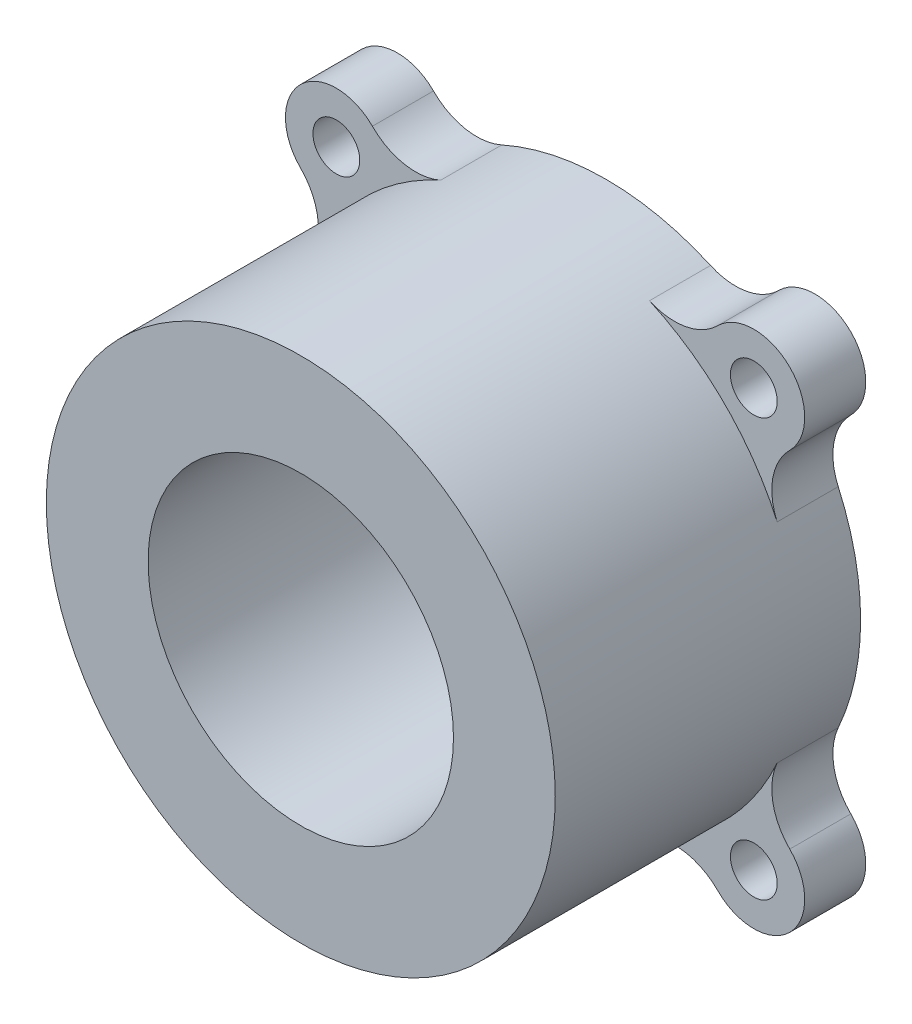
ISO-10303-21;
HEADER;
FILE_DESCRIPTION(('STEP AP214'),'2;1');
FILE_NAME('part.step','',(''),(''),'','','');
FILE_SCHEMA(('AUTOMOTIVE_DESIGN { 1 0 10303 214 1 1 1 1 }'));
ENDSEC;
DATA;
#1=APPLICATION_CONTEXT('core data for automotive mechanical design processes');
#2=APPLICATION_PROTOCOL_DEFINITION('international standard','automotive_design',2000,#1);
#3=PRODUCT_CONTEXT('',#1,'mechanical');
#4=PRODUCT('Part','Part','',(#3));
#5=PRODUCT_RELATED_PRODUCT_CATEGORY('part','',(#4));
#6=PRODUCT_DEFINITION_FORMATION('','',#4);
#7=PRODUCT_DEFINITION_CONTEXT('part definition',#1,'design');
#8=PRODUCT_DEFINITION('design','',#6,#7);
#9=PRODUCT_DEFINITION_SHAPE('','',#8);
#10=(LENGTH_UNIT() NAMED_UNIT(*) SI_UNIT(.MILLI.,.METRE.));
#11=(NAMED_UNIT(*) PLANE_ANGLE_UNIT() SI_UNIT($,.RADIAN.));
#12=(NAMED_UNIT(*) SI_UNIT($,.STERADIAN.) SOLID_ANGLE_UNIT());
#13=UNCERTAINTY_MEASURE_WITH_UNIT(LENGTH_MEASURE(1.E-05),#10,'distance_accuracy_value','');
#14=(GEOMETRIC_REPRESENTATION_CONTEXT(3) GLOBAL_UNCERTAINTY_ASSIGNED_CONTEXT((#13)) GLOBAL_UNIT_ASSIGNED_CONTEXT((#10,
#11,#12)) REPRESENTATION_CONTEXT('',''));
#15=CARTESIAN_POINT('',(0.,0.,0.));
#16=DIRECTION('',(0.,0.,1.));
#17=DIRECTION('',(1.,0.,0.));
#18=AXIS2_PLACEMENT_3D('',#15,#16,#17);
#19=CARTESIAN_POINT('',(0.,0.,30.));
#20=DIRECTION('',(0.,0.,1.));
#21=DIRECTION('',(1.,0.,0.));
#22=AXIS2_PLACEMENT_3D('',#19,#20,#21);
#23=PLANE('',#22);
#24=CARTESIAN_POINT('',(0.,0.,30.));
#25=DIRECTION('',(0.,0.,1.));
#26=DIRECTION('',(1.,0.,0.));
#27=AXIS2_PLACEMENT_3D('',#24,#25,#26);
#28=CIRCLE('',#27,25.);
#29=CARTESIAN_POINT('',(25.,0.,30.));
#30=VERTEX_POINT('',#29);
#31=EDGE_CURVE('E185',#30,#30,#28,.T.);
#32=ORIENTED_EDGE('',*,*,#31,.T.);
#33=EDGE_LOOP('',(#32));
#34=FACE_BOUND('',#33,.T.);
#35=CARTESIAN_POINT('',(0.,0.,30.));
#36=DIRECTION('',(0.,0.,1.));
#37=DIRECTION('',(1.,0.,0.));
#38=AXIS2_PLACEMENT_3D('',#35,#36,#37);
#39=CIRCLE('',#38,15.);
#40=CARTESIAN_POINT('',(15.,0.,30.));
#41=VERTEX_POINT('',#40);
#42=EDGE_CURVE('E182',#41,#41,#39,.T.);
#43=ORIENTED_EDGE('',*,*,#42,.F.);
#44=EDGE_LOOP('',(#43));
#45=FACE_BOUND('',#44,.T.);
#46=ADVANCED_FACE('F33',(#34,#45),#23,.T.);
#47=CARTESIAN_POINT('',(0.,0.,0.));
#48=DIRECTION('',(0.,0.,1.));
#49=DIRECTION('',(1.,0.,0.));
#50=AXIS2_PLACEMENT_3D('',#47,#48,#49);
#51=PLANE('',#50);
#52=CARTESIAN_POINT('',(0.,0.,0.));
#53=DIRECTION('',(0.,0.,1.));
#54=DIRECTION('',(1.,0.,0.));
#55=AXIS2_PLACEMENT_3D('',#52,#53,#54);
#56=CIRCLE('',#55,25.);
#57=CARTESIAN_POINT('',(10.2546291287098,22.8000566102941,0.));
#58=VERTEX_POINT('',#57);
#59=CARTESIAN_POINT('',(-10.2546291287101,22.800056610294,0.));
#60=VERTEX_POINT('',#59);
#61=EDGE_CURVE('E178',#58,#60,#56,.T.);
#62=ORIENTED_EDGE('',*,*,#61,.F.);
#63=CARTESIAN_POINT('',(12.7157401196002,28.2720701967647,0.));
#64=DIRECTION('',(0.,0.,1.));
#65=DIRECTION('',(1.,0.,0.));
#66=AXIS2_PLACEMENT_3D('',#63,#64,#65);
#67=CIRCLE('',#66,6.);
#68=CARTESIAN_POINT('',(16.9650255022235,24.0360846282076,0.));
#69=VERTEX_POINT('',#68);
#70=EDGE_CURVE('E247',#58,#69,#67,.T.);
#71=ORIENTED_EDGE('',*,*,#70,.T.);
#72=CARTESIAN_POINT('',(20.5060966544097,20.5060966544101,0.));
#73=DIRECTION('',(0.,0.,-1.));
#74=DIRECTION('',(-1.,0.,0.));
#75=AXIS2_PLACEMENT_3D('',#72,#73,#74);
#76=CIRCLE('',#75,5.);
#77=CARTESIAN_POINT('',(24.0360846282073,16.9650255022241,0.));
#78=VERTEX_POINT('',#77);
#79=EDGE_CURVE('E356',#69,#78,#76,.T.);
#80=ORIENTED_EDGE('',*,*,#79,.T.);
#81=CARTESIAN_POINT('',(28.2720701967644,12.7157401196008,0.));
#82=DIRECTION('',(0.,0.,1.));
#83=DIRECTION('',(1.,0.,0.));
#84=AXIS2_PLACEMENT_3D('',#81,#82,#83);
#85=CIRCLE('',#84,6.);
#86=CARTESIAN_POINT('',(22.8000566102939,10.2546291287103,0.));
#87=VERTEX_POINT('',#86);
#88=EDGE_CURVE('E11',#78,#87,#85,.T.);
#89=ORIENTED_EDGE('',*,*,#88,.T.);
#90=CARTESIAN_POINT('',(22.8000566102941,-10.2546291287099,0.));
#91=VERTEX_POINT('',#90);
#92=EDGE_CURVE('E164',#91,#87,#56,.T.);
#93=ORIENTED_EDGE('',*,*,#92,.F.);
#94=CARTESIAN_POINT('',(28.2720701967646,-12.7157401196003,0.));
#95=DIRECTION('',(0.,0.,1.));
#96=DIRECTION('',(1.,0.,0.));
#97=AXIS2_PLACEMENT_3D('',#94,#95,#96);
#98=CIRCLE('',#97,6.);
#99=CARTESIAN_POINT('',(24.0360846282076,-16.9650255022236,0.));
#100=VERTEX_POINT('',#99);
#101=EDGE_CURVE('E145',#91,#100,#98,.T.);
#102=ORIENTED_EDGE('',*,*,#101,.T.);
#103=CARTESIAN_POINT('',(20.50609665441,-20.5060966544097,0.));
#104=DIRECTION('',(0.,0.,-1.));
#105=DIRECTION('',(-1.,0.,0.));
#106=AXIS2_PLACEMENT_3D('',#103,#104,#105);
#107=CIRCLE('',#106,5.);
#108=CARTESIAN_POINT('',(16.965025502224,-24.0360846282073,0.));
#109=VERTEX_POINT('',#108);
#110=EDGE_CURVE('E260',#100,#109,#107,.T.);
#111=ORIENTED_EDGE('',*,*,#110,.T.);
#112=CARTESIAN_POINT('',(12.7157401196007,-28.2720701967645,0.));
#113=DIRECTION('',(0.,0.,1.));
#114=DIRECTION('',(1.,0.,0.));
#115=AXIS2_PLACEMENT_3D('',#112,#113,#114);
#116=CIRCLE('',#115,6.);
#117=CARTESIAN_POINT('',(10.2546291287103,-22.8000566102939,0.));
#118=VERTEX_POINT('',#117);
#119=EDGE_CURVE('E227',#109,#118,#116,.T.);
#120=ORIENTED_EDGE('',*,*,#119,.T.);
#121=CARTESIAN_POINT('',(-10.25462912871,-22.800056610294,0.));
#122=VERTEX_POINT('',#121);
#123=EDGE_CURVE('E177',#122,#118,#56,.T.);
#124=ORIENTED_EDGE('',*,*,#123,.F.);
#125=CARTESIAN_POINT('',(-12.7157401196004,-28.2720701967646,0.));
#126=DIRECTION('',(0.,0.,1.));
#127=DIRECTION('',(1.,0.,0.));
#128=AXIS2_PLACEMENT_3D('',#125,#126,#127);
#129=CIRCLE('',#128,6.);
#130=CARTESIAN_POINT('',(-16.9650255022237,-24.0360846282075,0.));
#131=VERTEX_POINT('',#130);
#132=EDGE_CURVE('E229',#122,#131,#129,.T.);
#133=ORIENTED_EDGE('',*,*,#132,.T.);
#134=CARTESIAN_POINT('',(-20.5060966544098,-20.50609665441,0.));
#135=DIRECTION('',(0.,0.,-1.));
#136=DIRECTION('',(-1.,0.,0.));
#137=AXIS2_PLACEMENT_3D('',#134,#135,#136);
#138=CIRCLE('',#137,5.);
#139=CARTESIAN_POINT('',(-24.0360846282074,-16.9650255022239,0.));
#140=VERTEX_POINT('',#139);
#141=EDGE_CURVE('E272',#131,#140,#138,.T.);
#142=ORIENTED_EDGE('',*,*,#141,.T.);
#143=CARTESIAN_POINT('',(-28.2720701967645,-12.7157401196006,0.));
#144=DIRECTION('',(0.,0.,1.));
#145=DIRECTION('',(1.,0.,0.));
#146=AXIS2_PLACEMENT_3D('',#143,#144,#145);
#147=CIRCLE('',#146,6.);
#148=CARTESIAN_POINT('',(-22.800056610294,-10.2546291287102,0.));
#149=VERTEX_POINT('',#148);
#150=EDGE_CURVE('E245',#140,#149,#147,.T.);
#151=ORIENTED_EDGE('',*,*,#150,.T.);
#152=CARTESIAN_POINT('',(-22.800056610294,10.2546291287101,0.));
#153=VERTEX_POINT('',#152);
#154=EDGE_CURVE('E180',#153,#149,#56,.T.);
#155=ORIENTED_EDGE('',*,*,#154,.F.);
#156=CARTESIAN_POINT('',(-28.2720701967646,12.7157401196005,0.));
#157=DIRECTION('',(0.,0.,1.));
#158=DIRECTION('',(1.,0.,0.));
#159=AXIS2_PLACEMENT_3D('',#156,#157,#158);
#160=CIRCLE('',#159,6.);
#161=CARTESIAN_POINT('',(-24.0360846282075,16.9650255022238,0.));
#162=VERTEX_POINT('',#161);
#163=EDGE_CURVE('E234',#153,#162,#160,.T.);
#164=ORIENTED_EDGE('',*,*,#163,.T.);
#165=CARTESIAN_POINT('',(-20.5060966544099,20.5060966544099,0.));
#166=DIRECTION('',(0.,0.,-1.));
#167=DIRECTION('',(-1.,0.,0.));
#168=AXIS2_PLACEMENT_3D('',#165,#166,#167);
#169=CIRCLE('',#168,5.);
#170=CARTESIAN_POINT('',(-16.9650255022238,24.0360846282075,0.));
#171=VERTEX_POINT('',#170);
#172=EDGE_CURVE('E283',#162,#171,#169,.T.);
#173=ORIENTED_EDGE('',*,*,#172,.T.);
#174=CARTESIAN_POINT('',(-12.7157401196005,28.2720701967645,0.));
#175=DIRECTION('',(0.,0.,1.));
#176=DIRECTION('',(1.,0.,0.));
#177=AXIS2_PLACEMENT_3D('',#174,#175,#176);
#178=CIRCLE('',#177,6.);
#179=EDGE_CURVE('E241',#171,#60,#178,.T.);
#180=ORIENTED_EDGE('',*,*,#179,.T.);
#181=EDGE_LOOP('',(#62,#71,#80,#89,#93,#102,#111,#120,#124,#133,#142,#151,#155,#164,#173,#180));
#182=FACE_BOUND('',#181,.T.);
#183=CARTESIAN_POINT('',(0.,0.,0.));
#184=DIRECTION('',(0.,0.,1.));
#185=DIRECTION('',(1.,0.,0.));
#186=AXIS2_PLACEMENT_3D('',#183,#184,#185);
#187=CIRCLE('',#186,15.);
#188=CARTESIAN_POINT('',(15.,0.,0.));
#189=VERTEX_POINT('',#188);
#190=EDGE_CURVE('E289',#189,#189,#187,.T.);
#191=ORIENTED_EDGE('',*,*,#190,.T.);
#192=EDGE_LOOP('',(#191));
#193=FACE_BOUND('',#192,.T.);
#194=CARTESIAN_POINT('',(-20.5060966544099,20.5060966544099,0.));
#195=DIRECTION('',(0.,0.,-1.));
#196=DIRECTION('',(-1.,0.,0.));
#197=AXIS2_PLACEMENT_3D('',#194,#195,#196);
#198=CIRCLE('',#197,2.3);
#199=CARTESIAN_POINT('',(-22.8060966544099,20.5060966544099,0.));
#200=VERTEX_POINT('',#199);
#201=EDGE_CURVE('E277',#200,#200,#198,.T.);
#202=ORIENTED_EDGE('',*,*,#201,.F.);
#203=EDGE_LOOP('',(#202));
#204=FACE_BOUND('',#203,.T.);
#205=CARTESIAN_POINT('',(-20.5060966544098,-20.50609665441,0.));
#206=DIRECTION('',(0.,0.,-1.));
#207=DIRECTION('',(-1.,0.,0.));
#208=AXIS2_PLACEMENT_3D('',#205,#206,#207);
#209=CIRCLE('',#208,2.3);
#210=CARTESIAN_POINT('',(-22.8060966544098,-20.50609665441,0.));
#211=VERTEX_POINT('',#210);
#212=EDGE_CURVE('E259',#211,#211,#209,.T.);
#213=ORIENTED_EDGE('',*,*,#212,.F.);
#214=EDGE_LOOP('',(#213));
#215=FACE_BOUND('',#214,.T.);
#216=CARTESIAN_POINT('',(20.50609665441,-20.5060966544097,0.));
#217=DIRECTION('',(0.,0.,-1.));
#218=DIRECTION('',(-1.,0.,0.));
#219=AXIS2_PLACEMENT_3D('',#216,#217,#218);
#220=CIRCLE('',#219,2.3);
#221=CARTESIAN_POINT('',(18.20609665441,-20.5060966544097,0.));
#222=VERTEX_POINT('',#221);
#223=EDGE_CURVE('E268',#222,#222,#220,.T.);
#224=ORIENTED_EDGE('',*,*,#223,.F.);
#225=EDGE_LOOP('',(#224));
#226=FACE_BOUND('',#225,.T.);
#227=CARTESIAN_POINT('',(20.5060966544097,20.5060966544101,0.));
#228=DIRECTION('',(0.,0.,-1.));
#229=DIRECTION('',(-1.,0.,0.));
#230=AXIS2_PLACEMENT_3D('',#227,#228,#229);
#231=CIRCLE('',#230,2.3);
#232=CARTESIAN_POINT('',(18.2060966544097,20.5060966544101,0.));
#233=VERTEX_POINT('',#232);
#234=EDGE_CURVE('E362',#233,#233,#231,.T.);
#235=ORIENTED_EDGE('',*,*,#234,.F.);
#236=EDGE_LOOP('',(#235));
#237=FACE_BOUND('',#236,.T.);
#238=ADVANCED_FACE('F173',(#182,#193,#204,#215,#226,#237),#51,.F.);
#239=CARTESIAN_POINT('',(0.,0.,30.));
#240=DIRECTION('',(0.,0.,-1.));
#241=DIRECTION('',(-1.,0.,0.));
#242=AXIS2_PLACEMENT_3D('',#239,#240,#241);
#243=CYLINDRICAL_SURFACE('',#242,25.);
#244=ORIENTED_EDGE('',*,*,#123,.T.);
#245=DIRECTION('',(0.,0.,-1.));
#246=VECTOR('',#245,1.);
#247=CARTESIAN_POINT('',(10.2546291287103,-22.8000566102939,30.));
#248=LINE('',#247,#246);
#249=CARTESIAN_POINT('',(10.2546291287103,-22.8000566102939,6.));
#250=VERTEX_POINT('',#249);
#251=EDGE_CURVE('E209',#118,#250,#248,.F.);
#252=ORIENTED_EDGE('',*,*,#251,.T.);
#253=CARTESIAN_POINT('',(0.,0.,6.));
#254=DIRECTION('',(0.,0.,-1.));
#255=DIRECTION('',(-1.,0.,0.));
#256=AXIS2_PLACEMENT_3D('',#253,#254,#255);
#257=CIRCLE('',#256,25.);
#258=CARTESIAN_POINT('',(22.8000566102941,-10.2546291287099,6.));
#259=VERTEX_POINT('',#258);
#260=EDGE_CURVE('E167',#259,#250,#257,.T.);
#261=ORIENTED_EDGE('',*,*,#260,.F.);
#262=DIRECTION('',(0.,0.,-1.));
#263=VECTOR('',#262,1.);
#264=CARTESIAN_POINT('',(22.8000566102941,-10.2546291287099,30.));
#265=LINE('',#264,#263);
#266=EDGE_CURVE('E149',#259,#91,#265,.T.);
#267=ORIENTED_EDGE('',*,*,#266,.T.);
#268=ORIENTED_EDGE('',*,*,#92,.T.);
#269=DIRECTION('',(0.,0.,-1.));
#270=VECTOR('',#269,1.);
#271=CARTESIAN_POINT('',(22.8000566102939,10.2546291287103,30.));
#272=LINE('',#271,#270);
#273=CARTESIAN_POINT('',(22.8000566102939,10.2546291287103,6.));
#274=VERTEX_POINT('',#273);
#275=EDGE_CURVE('E170',#87,#274,#272,.F.);
#276=ORIENTED_EDGE('',*,*,#275,.T.);
#277=CARTESIAN_POINT('',(0.,0.,6.));
#278=DIRECTION('',(0.,0.,-1.));
#279=DIRECTION('',(-1.,0.,0.));
#280=AXIS2_PLACEMENT_3D('',#277,#278,#279);
#281=CIRCLE('',#280,25.);
#282=CARTESIAN_POINT('',(10.2546291287098,22.8000566102941,6.));
#283=VERTEX_POINT('',#282);
#284=EDGE_CURVE('E192',#283,#274,#281,.T.);
#285=ORIENTED_EDGE('',*,*,#284,.F.);
#286=DIRECTION('',(0.,0.,-1.));
#287=VECTOR('',#286,1.);
#288=CARTESIAN_POINT('',(10.2546291287098,22.8000566102941,30.));
#289=LINE('',#288,#287);
#290=EDGE_CURVE('E169',#283,#58,#289,.T.);
#291=ORIENTED_EDGE('',*,*,#290,.T.);
#292=ORIENTED_EDGE('',*,*,#61,.T.);
#293=DIRECTION('',(0.,0.,-1.));
#294=VECTOR('',#293,1.);
#295=CARTESIAN_POINT('',(-10.2546291287101,22.800056610294,30.));
#296=LINE('',#295,#294);
#297=CARTESIAN_POINT('',(-10.2546291287101,22.800056610294,6.));
#298=VERTEX_POINT('',#297);
#299=EDGE_CURVE('E200',#60,#298,#296,.F.);
#300=ORIENTED_EDGE('',*,*,#299,.T.);
#301=CARTESIAN_POINT('',(0.,0.,6.));
#302=DIRECTION('',(0.,0.,-1.));
#303=DIRECTION('',(-1.,0.,0.));
#304=AXIS2_PLACEMENT_3D('',#301,#302,#303);
#305=CIRCLE('',#304,25.);
#306=CARTESIAN_POINT('',(-22.800056610294,10.2546291287101,6.));
#307=VERTEX_POINT('',#306);
#308=EDGE_CURVE('E187',#307,#298,#305,.T.);
#309=ORIENTED_EDGE('',*,*,#308,.F.);
#310=DIRECTION('',(0.,0.,-1.));
#311=VECTOR('',#310,1.);
#312=CARTESIAN_POINT('',(-22.800056610294,10.2546291287101,30.));
#313=LINE('',#312,#311);
#314=EDGE_CURVE('E203',#307,#153,#313,.T.);
#315=ORIENTED_EDGE('',*,*,#314,.T.);
#316=ORIENTED_EDGE('',*,*,#154,.T.);
#317=DIRECTION('',(0.,0.,-1.));
#318=VECTOR('',#317,1.);
#319=CARTESIAN_POINT('',(-22.800056610294,-10.2546291287102,30.));
#320=LINE('',#319,#318);
#321=CARTESIAN_POINT('',(-22.800056610294,-10.2546291287102,6.));
#322=VERTEX_POINT('',#321);
#323=EDGE_CURVE('E197',#149,#322,#320,.F.);
#324=ORIENTED_EDGE('',*,*,#323,.T.);
#325=CARTESIAN_POINT('',(0.,0.,6.));
#326=DIRECTION('',(0.,0.,-1.));
#327=DIRECTION('',(-1.,0.,0.));
#328=AXIS2_PLACEMENT_3D('',#325,#326,#327);
#329=CIRCLE('',#328,25.);
#330=CARTESIAN_POINT('',(-10.25462912871,-22.800056610294,6.));
#331=VERTEX_POINT('',#330);
#332=EDGE_CURVE('E189',#331,#322,#329,.T.);
#333=ORIENTED_EDGE('',*,*,#332,.F.);
#334=DIRECTION('',(0.,0.,-1.));
#335=VECTOR('',#334,1.);
#336=CARTESIAN_POINT('',(-10.25462912871,-22.800056610294,30.));
#337=LINE('',#336,#335);
#338=EDGE_CURVE('E206',#331,#122,#337,.T.);
#339=ORIENTED_EDGE('',*,*,#338,.T.);
#340=EDGE_LOOP('',(#244,#252,#261,#267,#268,#276,#285,#291,#292,#300,#309,#315,#316,#324,#333,#339));
#341=FACE_BOUND('',#340,.T.);
#342=ORIENTED_EDGE('',*,*,#31,.F.);
#343=EDGE_LOOP('',(#342));
#344=FACE_BOUND('',#343,.T.);
#345=ADVANCED_FACE('F161',(#341,#344),#243,.T.);
#346=CARTESIAN_POINT('',(0.,0.,30.));
#347=DIRECTION('',(0.,0.,-1.));
#348=DIRECTION('',(-1.,0.,0.));
#349=AXIS2_PLACEMENT_3D('',#346,#347,#348);
#350=CYLINDRICAL_SURFACE('',#349,15.);
#351=ORIENTED_EDGE('',*,*,#42,.T.);
#352=EDGE_LOOP('',(#351));
#353=FACE_BOUND('',#352,.T.);
#354=ORIENTED_EDGE('',*,*,#190,.F.);
#355=EDGE_LOOP('',(#354));
#356=FACE_BOUND('',#355,.T.);
#357=ADVANCED_FACE('F297',(#353,#356),#350,.F.);
#358=CARTESIAN_POINT('',(-20.5060966544099,20.5060966544099,6.));
#359=DIRECTION('',(0.,0.,-1.));
#360=DIRECTION('',(-1.,0.,0.));
#361=AXIS2_PLACEMENT_3D('',#358,#359,#360);
#362=CYLINDRICAL_SURFACE('',#361,5.);
#363=ORIENTED_EDGE('',*,*,#172,.F.);
#364=DIRECTION('',(0.,0.,-1.));
#365=VECTOR('',#364,1.);
#366=CARTESIAN_POINT('',(-24.0360846282075,16.9650255022238,6.));
#367=LINE('',#366,#365);
#368=CARTESIAN_POINT('',(-24.0360846282075,16.9650255022238,6.));
#369=VERTEX_POINT('',#368);
#370=EDGE_CURVE('E220',#162,#369,#367,.F.);
#371=ORIENTED_EDGE('',*,*,#370,.T.);
#372=CARTESIAN_POINT('',(-20.5060966544099,20.5060966544099,6.));
#373=DIRECTION('',(0.,0.,-1.));
#374=DIRECTION('',(-1.,0.,0.));
#375=AXIS2_PLACEMENT_3D('',#372,#373,#374);
#376=CIRCLE('',#375,5.);
#377=CARTESIAN_POINT('',(-16.9650255022238,24.0360846282075,6.));
#378=VERTEX_POINT('',#377);
#379=EDGE_CURVE('E286',#369,#378,#376,.T.);
#380=ORIENTED_EDGE('',*,*,#379,.T.);
#381=DIRECTION('',(0.,0.,-1.));
#382=VECTOR('',#381,1.);
#383=CARTESIAN_POINT('',(-16.9650255022238,24.0360846282075,6.));
#384=LINE('',#383,#382);
#385=EDGE_CURVE('E218',#378,#171,#384,.T.);
#386=ORIENTED_EDGE('',*,*,#385,.T.);
#387=EDGE_LOOP('',(#363,#371,#380,#386));
#388=FACE_BOUND('',#387,.T.);
#389=ADVANCED_FACE('F299',(#388),#362,.T.);
#390=CARTESIAN_POINT('',(-20.5060966544099,20.5060966544099,6.));
#391=DIRECTION('',(0.,0.,-1.));
#392=DIRECTION('',(-1.,0.,0.));
#393=AXIS2_PLACEMENT_3D('',#390,#391,#392);
#394=PLANE('',#393);
#395=CARTESIAN_POINT('',(-20.5060966544099,20.5060966544099,6.));
#396=DIRECTION('',(0.,0.,-1.));
#397=DIRECTION('',(-1.,0.,0.));
#398=AXIS2_PLACEMENT_3D('',#395,#396,#397);
#399=CIRCLE('',#398,2.3);
#400=CARTESIAN_POINT('',(-22.8060966544099,20.5060966544099,6.));
#401=VERTEX_POINT('',#400);
#402=EDGE_CURVE('E280',#401,#401,#399,.T.);
#403=ORIENTED_EDGE('',*,*,#402,.T.);
#404=EDGE_LOOP('',(#403));
#405=FACE_BOUND('',#404,.T.);
#406=ORIENTED_EDGE('',*,*,#379,.F.);
#407=CARTESIAN_POINT('',(-28.2720701967646,12.7157401196005,6.));
#408=DIRECTION('',(0.,0.,-1.));
#409=DIRECTION('',(-1.,0.,0.));
#410=AXIS2_PLACEMENT_3D('',#407,#408,#409);
#411=CIRCLE('',#410,6.);
#412=EDGE_CURVE('E236',#369,#307,#411,.T.);
#413=ORIENTED_EDGE('',*,*,#412,.T.);
#414=ORIENTED_EDGE('',*,*,#308,.T.);
#415=CARTESIAN_POINT('',(-12.7157401196005,28.2720701967645,6.));
#416=DIRECTION('',(0.,0.,-1.));
#417=DIRECTION('',(-1.,0.,0.));
#418=AXIS2_PLACEMENT_3D('',#415,#416,#417);
#419=CIRCLE('',#418,6.);
#420=EDGE_CURVE('E239',#298,#378,#419,.T.);
#421=ORIENTED_EDGE('',*,*,#420,.T.);
#422=EDGE_LOOP('',(#406,#413,#414,#421));
#423=FACE_BOUND('',#422,.T.);
#424=ADVANCED_FACE('F306',(#405,#423),#394,.F.);
#425=CARTESIAN_POINT('',(-20.5060966544099,20.5060966544099,6.));
#426=DIRECTION('',(0.,0.,-1.));
#427=DIRECTION('',(-1.,0.,0.));
#428=AXIS2_PLACEMENT_3D('',#425,#426,#427);
#429=CYLINDRICAL_SURFACE('',#428,2.3);
#430=ORIENTED_EDGE('',*,*,#402,.F.);
#431=EDGE_LOOP('',(#430));
#432=FACE_BOUND('',#431,.T.);
#433=ORIENTED_EDGE('',*,*,#201,.T.);
#434=EDGE_LOOP('',(#433));
#435=FACE_BOUND('',#434,.T.);
#436=ADVANCED_FACE('F408',(#432,#435),#429,.F.);
#437=CARTESIAN_POINT('',(-20.5060966544098,-20.50609665441,6.));
#438=DIRECTION('',(0.,0.,-1.));
#439=DIRECTION('',(-1.,0.,0.));
#440=AXIS2_PLACEMENT_3D('',#437,#438,#439);
#441=CYLINDRICAL_SURFACE('',#440,5.);
#442=ORIENTED_EDGE('',*,*,#141,.F.);
#443=DIRECTION('',(0.,0.,-1.));
#444=VECTOR('',#443,1.);
#445=CARTESIAN_POINT('',(-16.9650255022237,-24.0360846282075,6.));
#446=LINE('',#445,#444);
#447=CARTESIAN_POINT('',(-16.9650255022237,-24.0360846282075,6.));
#448=VERTEX_POINT('',#447);
#449=EDGE_CURVE('E216',#131,#448,#446,.F.);
#450=ORIENTED_EDGE('',*,*,#449,.T.);
#451=CARTESIAN_POINT('',(-20.5060966544098,-20.50609665441,6.));
#452=DIRECTION('',(0.,0.,-1.));
#453=DIRECTION('',(-1.,0.,0.));
#454=AXIS2_PLACEMENT_3D('',#451,#452,#453);
#455=CIRCLE('',#454,5.);
#456=CARTESIAN_POINT('',(-24.0360846282074,-16.9650255022239,6.));
#457=VERTEX_POINT('',#456);
#458=EDGE_CURVE('E274',#448,#457,#455,.T.);
#459=ORIENTED_EDGE('',*,*,#458,.T.);
#460=DIRECTION('',(0.,0.,-1.));
#461=VECTOR('',#460,1.);
#462=CARTESIAN_POINT('',(-24.0360846282074,-16.9650255022239,6.));
#463=LINE('',#462,#461);
#464=EDGE_CURVE('E214',#457,#140,#463,.T.);
#465=ORIENTED_EDGE('',*,*,#464,.T.);
#466=EDGE_LOOP('',(#442,#450,#459,#465));
#467=FACE_BOUND('',#466,.T.);
#468=ADVANCED_FACE('F404',(#467),#441,.T.);
#469=CARTESIAN_POINT('',(-20.5060966544098,-20.50609665441,6.));
#470=DIRECTION('',(0.,0.,-1.));
#471=DIRECTION('',(-1.,0.,0.));
#472=AXIS2_PLACEMENT_3D('',#469,#470,#471);
#473=PLANE('',#472);
#474=CARTESIAN_POINT('',(-20.5060966544098,-20.50609665441,6.));
#475=DIRECTION('',(0.,0.,-1.));
#476=DIRECTION('',(-1.,0.,0.));
#477=AXIS2_PLACEMENT_3D('',#474,#475,#476);
#478=CIRCLE('',#477,2.3);
#479=CARTESIAN_POINT('',(-22.8060966544098,-20.50609665441,6.));
#480=VERTEX_POINT('',#479);
#481=EDGE_CURVE('E263',#480,#480,#478,.T.);
#482=ORIENTED_EDGE('',*,*,#481,.T.);
#483=EDGE_LOOP('',(#482));
#484=FACE_BOUND('',#483,.T.);
#485=ORIENTED_EDGE('',*,*,#458,.F.);
#486=CARTESIAN_POINT('',(-12.7157401196004,-28.2720701967646,6.));
#487=DIRECTION('',(0.,0.,-1.));
#488=DIRECTION('',(-1.,0.,0.));
#489=AXIS2_PLACEMENT_3D('',#486,#487,#488);
#490=CIRCLE('',#489,6.);
#491=EDGE_CURVE('E231',#448,#331,#490,.T.);
#492=ORIENTED_EDGE('',*,*,#491,.T.);
#493=ORIENTED_EDGE('',*,*,#332,.T.);
#494=CARTESIAN_POINT('',(-28.2720701967645,-12.7157401196006,6.));
#495=DIRECTION('',(0.,0.,-1.));
#496=DIRECTION('',(-1.,0.,0.));
#497=AXIS2_PLACEMENT_3D('',#494,#495,#496);
#498=CIRCLE('',#497,6.);
#499=EDGE_CURVE('E243',#322,#457,#498,.T.);
#500=ORIENTED_EDGE('',*,*,#499,.T.);
#501=EDGE_LOOP('',(#485,#492,#493,#500));
#502=FACE_BOUND('',#501,.T.);
#503=ADVANCED_FACE('F400',(#484,#502),#473,.F.);
#504=CARTESIAN_POINT('',(-20.5060966544098,-20.50609665441,6.));
#505=DIRECTION('',(0.,0.,-1.));
#506=DIRECTION('',(-1.,0.,0.));
#507=AXIS2_PLACEMENT_3D('',#504,#505,#506);
#508=CYLINDRICAL_SURFACE('',#507,2.3);
#509=ORIENTED_EDGE('',*,*,#481,.F.);
#510=EDGE_LOOP('',(#509));
#511=FACE_BOUND('',#510,.T.);
#512=ORIENTED_EDGE('',*,*,#212,.T.);
#513=EDGE_LOOP('',(#512));
#514=FACE_BOUND('',#513,.T.);
#515=ADVANCED_FACE('F397',(#511,#514),#508,.F.);
#516=CARTESIAN_POINT('',(20.50609665441,-20.5060966544097,6.));
#517=DIRECTION('',(0.,0.,-1.));
#518=DIRECTION('',(-1.,0.,0.));
#519=AXIS2_PLACEMENT_3D('',#516,#517,#518);
#520=CYLINDRICAL_SURFACE('',#519,5.);
#521=CARTESIAN_POINT('',(20.50609665441,-20.5060966544097,6.));
#522=DIRECTION('',(0.,0.,-1.));
#523=DIRECTION('',(-1.,0.,0.));
#524=AXIS2_PLACEMENT_3D('',#521,#522,#523);
#525=CIRCLE('',#524,5.);
#526=CARTESIAN_POINT('',(24.0360846282076,-16.9650255022236,6.));
#527=VERTEX_POINT('',#526);
#528=CARTESIAN_POINT('',(16.965025502224,-24.0360846282073,6.));
#529=VERTEX_POINT('',#528);
#530=EDGE_CURVE('E256',#527,#529,#525,.T.);
#531=ORIENTED_EDGE('',*,*,#530,.T.);
#532=DIRECTION('',(0.,0.,-1.));
#533=VECTOR('',#532,1.);
#534=CARTESIAN_POINT('',(16.965025502224,-24.0360846282073,6.));
#535=LINE('',#534,#533);
#536=EDGE_CURVE('E212',#529,#109,#535,.T.);
#537=ORIENTED_EDGE('',*,*,#536,.T.);
#538=ORIENTED_EDGE('',*,*,#110,.F.);
#539=DIRECTION('',(0.,0.,-1.));
#540=VECTOR('',#539,1.);
#541=CARTESIAN_POINT('',(24.0360846282076,-16.9650255022236,6.));
#542=LINE('',#541,#540);
#543=EDGE_CURVE('E150',#100,#527,#542,.F.);
#544=ORIENTED_EDGE('',*,*,#543,.T.);
#545=EDGE_LOOP('',(#531,#537,#538,#544));
#546=FACE_BOUND('',#545,.T.);
#547=ADVANCED_FACE('F394',(#546),#520,.T.);
#548=CARTESIAN_POINT('',(20.50609665441,-20.5060966544097,6.));
#549=DIRECTION('',(0.,0.,-1.));
#550=DIRECTION('',(-1.,0.,0.));
#551=AXIS2_PLACEMENT_3D('',#548,#549,#550);
#552=PLANE('',#551);
#553=CARTESIAN_POINT('',(20.50609665441,-20.5060966544097,6.));
#554=DIRECTION('',(0.,0.,-1.));
#555=DIRECTION('',(-1.,0.,0.));
#556=AXIS2_PLACEMENT_3D('',#553,#554,#555);
#557=CIRCLE('',#556,2.3);
#558=CARTESIAN_POINT('',(18.20609665441,-20.5060966544097,6.));
#559=VERTEX_POINT('',#558);
#560=EDGE_CURVE('E265',#559,#559,#557,.T.);
#561=ORIENTED_EDGE('',*,*,#560,.T.);
#562=EDGE_LOOP('',(#561));
#563=FACE_BOUND('',#562,.T.);
#564=ORIENTED_EDGE('',*,*,#530,.F.);
#565=CARTESIAN_POINT('',(28.2720701967646,-12.7157401196003,6.));
#566=DIRECTION('',(0.,0.,-1.));
#567=DIRECTION('',(-1.,0.,0.));
#568=AXIS2_PLACEMENT_3D('',#565,#566,#567);
#569=CIRCLE('',#568,6.);
#570=EDGE_CURVE('E155',#527,#259,#569,.T.);
#571=ORIENTED_EDGE('',*,*,#570,.T.);
#572=ORIENTED_EDGE('',*,*,#260,.T.);
#573=CARTESIAN_POINT('',(12.7157401196007,-28.2720701967645,6.));
#574=DIRECTION('',(0.,0.,-1.));
#575=DIRECTION('',(-1.,0.,0.));
#576=AXIS2_PLACEMENT_3D('',#573,#574,#575);
#577=CIRCLE('',#576,6.);
#578=EDGE_CURVE('E225',#250,#529,#577,.T.);
#579=ORIENTED_EDGE('',*,*,#578,.T.);
#580=EDGE_LOOP('',(#564,#571,#572,#579));
#581=FACE_BOUND('',#580,.T.);
#582=ADVANCED_FACE('F253',(#563,#581),#552,.F.);
#583=CARTESIAN_POINT('',(20.50609665441,-20.5060966544097,6.));
#584=DIRECTION('',(0.,0.,-1.));
#585=DIRECTION('',(-1.,0.,0.));
#586=AXIS2_PLACEMENT_3D('',#583,#584,#585);
#587=CYLINDRICAL_SURFACE('',#586,2.3);
#588=ORIENTED_EDGE('',*,*,#560,.F.);
#589=EDGE_LOOP('',(#588));
#590=FACE_BOUND('',#589,.T.);
#591=ORIENTED_EDGE('',*,*,#223,.T.);
#592=EDGE_LOOP('',(#591));
#593=FACE_BOUND('',#592,.T.);
#594=ADVANCED_FACE('F371',(#590,#593),#587,.F.);
#595=CARTESIAN_POINT('',(20.5060966544097,20.5060966544101,6.));
#596=DIRECTION('',(0.,0.,-1.));
#597=DIRECTION('',(-1.,0.,0.));
#598=AXIS2_PLACEMENT_3D('',#595,#596,#597);
#599=CYLINDRICAL_SURFACE('',#598,5.);
#600=ORIENTED_EDGE('',*,*,#79,.F.);
#601=DIRECTION('',(0.,0.,-1.));
#602=VECTOR('',#601,1.);
#603=CARTESIAN_POINT('',(16.9650255022235,24.0360846282076,6.));
#604=LINE('',#603,#602);
#605=CARTESIAN_POINT('',(16.9650255022235,24.0360846282076,6.));
#606=VERTEX_POINT('',#605);
#607=EDGE_CURVE('E54',#69,#606,#604,.F.);
#608=ORIENTED_EDGE('',*,*,#607,.T.);
#609=CARTESIAN_POINT('',(20.5060966544097,20.5060966544101,6.));
#610=DIRECTION('',(0.,0.,-1.));
#611=DIRECTION('',(-1.,0.,0.));
#612=AXIS2_PLACEMENT_3D('',#609,#610,#611);
#613=CIRCLE('',#612,5.);
#614=CARTESIAN_POINT('',(24.0360846282073,16.9650255022241,6.));
#615=VERTEX_POINT('',#614);
#616=EDGE_CURVE('E355',#606,#615,#613,.T.);
#617=ORIENTED_EDGE('',*,*,#616,.T.);
#618=DIRECTION('',(0.,0.,-1.));
#619=VECTOR('',#618,1.);
#620=CARTESIAN_POINT('',(24.0360846282073,16.9650255022241,6.));
#621=LINE('',#620,#619);
#622=EDGE_CURVE('E222',#615,#78,#621,.T.);
#623=ORIENTED_EDGE('',*,*,#622,.T.);
#624=EDGE_LOOP('',(#600,#608,#617,#623));
#625=FACE_BOUND('',#624,.T.);
#626=ADVANCED_FACE('F357',(#625),#599,.T.);
#627=CARTESIAN_POINT('',(20.5060966544097,20.5060966544101,6.));
#628=DIRECTION('',(0.,0.,-1.));
#629=DIRECTION('',(-1.,0.,0.));
#630=AXIS2_PLACEMENT_3D('',#627,#628,#629);
#631=PLANE('',#630);
#632=CARTESIAN_POINT('',(20.5060966544097,20.5060966544101,6.));
#633=DIRECTION('',(0.,0.,-1.));
#634=DIRECTION('',(-1.,0.,0.));
#635=AXIS2_PLACEMENT_3D('',#632,#633,#634);
#636=CIRCLE('',#635,2.3);
#637=CARTESIAN_POINT('',(18.2060966544097,20.5060966544101,6.));
#638=VERTEX_POINT('',#637);
#639=EDGE_CURVE('E358',#638,#638,#636,.T.);
#640=ORIENTED_EDGE('',*,*,#639,.T.);
#641=EDGE_LOOP('',(#640));
#642=FACE_BOUND('',#641,.T.);
#643=ORIENTED_EDGE('',*,*,#616,.F.);
#644=CARTESIAN_POINT('',(12.7157401196002,28.2720701967647,6.));
#645=DIRECTION('',(0.,0.,-1.));
#646=DIRECTION('',(-1.,0.,0.));
#647=AXIS2_PLACEMENT_3D('',#644,#645,#646);
#648=CIRCLE('',#647,6.);
#649=EDGE_CURVE('E156',#606,#283,#648,.T.);
#650=ORIENTED_EDGE('',*,*,#649,.T.);
#651=ORIENTED_EDGE('',*,*,#284,.T.);
#652=CARTESIAN_POINT('',(28.2720701967644,12.7157401196008,6.));
#653=DIRECTION('',(0.,0.,-1.));
#654=DIRECTION('',(-1.,0.,0.));
#655=AXIS2_PLACEMENT_3D('',#652,#653,#654);
#656=CIRCLE('',#655,6.);
#657=EDGE_CURVE('E41',#274,#615,#656,.T.);
#658=ORIENTED_EDGE('',*,*,#657,.T.);
#659=EDGE_LOOP('',(#643,#650,#651,#658));
#660=FACE_BOUND('',#659,.T.);
#661=ADVANCED_FACE('F354',(#642,#660),#631,.F.);
#662=CARTESIAN_POINT('',(20.5060966544097,20.5060966544101,6.));
#663=DIRECTION('',(0.,0.,-1.));
#664=DIRECTION('',(-1.,0.,0.));
#665=AXIS2_PLACEMENT_3D('',#662,#663,#664);
#666=CYLINDRICAL_SURFACE('',#665,2.3);
#667=ORIENTED_EDGE('',*,*,#639,.F.);
#668=EDGE_LOOP('',(#667));
#669=FACE_BOUND('',#668,.T.);
#670=ORIENTED_EDGE('',*,*,#234,.T.);
#671=EDGE_LOOP('',(#670));
#672=FACE_BOUND('',#671,.T.);
#673=ADVANCED_FACE('F324',(#669,#672),#666,.F.);
#674=CARTESIAN_POINT('',(12.7157401196007,-28.2720701967645,6.));
#675=DIRECTION('',(0.,0.,-1.));
#676=DIRECTION('',(-1.,0.,0.));
#677=AXIS2_PLACEMENT_3D('',#674,#675,#676);
#678=CYLINDRICAL_SURFACE('',#677,6.);
#679=ORIENTED_EDGE('',*,*,#119,.F.);
#680=ORIENTED_EDGE('',*,*,#536,.F.);
#681=ORIENTED_EDGE('',*,*,#578,.F.);
#682=ORIENTED_EDGE('',*,*,#251,.F.);
#683=EDGE_LOOP('',(#679,#680,#681,#682));
#684=FACE_BOUND('',#683,.T.);
#685=ADVANCED_FACE('F320',(#684),#678,.F.);
#686=CARTESIAN_POINT('',(-12.7157401196004,-28.2720701967646,6.));
#687=DIRECTION('',(0.,0.,1.));
#688=DIRECTION('',(1.,0.,0.));
#689=AXIS2_PLACEMENT_3D('',#686,#687,#688);
#690=CYLINDRICAL_SURFACE('',#689,6.);
#691=ORIENTED_EDGE('',*,*,#491,.F.);
#692=ORIENTED_EDGE('',*,*,#449,.F.);
#693=ORIENTED_EDGE('',*,*,#132,.F.);
#694=ORIENTED_EDGE('',*,*,#338,.F.);
#695=EDGE_LOOP('',(#691,#692,#693,#694));
#696=FACE_BOUND('',#695,.T.);
#697=ADVANCED_FACE('F323',(#696),#690,.F.);
#698=CARTESIAN_POINT('',(-28.2720701967646,12.7157401196005,6.));
#699=DIRECTION('',(0.,0.,1.));
#700=DIRECTION('',(1.,0.,0.));
#701=AXIS2_PLACEMENT_3D('',#698,#699,#700);
#702=CYLINDRICAL_SURFACE('',#701,6.);
#703=ORIENTED_EDGE('',*,*,#412,.F.);
#704=ORIENTED_EDGE('',*,*,#370,.F.);
#705=ORIENTED_EDGE('',*,*,#163,.F.);
#706=ORIENTED_EDGE('',*,*,#314,.F.);
#707=EDGE_LOOP('',(#703,#704,#705,#706));
#708=FACE_BOUND('',#707,.T.);
#709=ADVANCED_FACE('F328',(#708),#702,.F.);
#710=CARTESIAN_POINT('',(-12.7157401196005,28.2720701967645,6.));
#711=DIRECTION('',(0.,0.,-1.));
#712=DIRECTION('',(-1.,0.,0.));
#713=AXIS2_PLACEMENT_3D('',#710,#711,#712);
#714=CYLINDRICAL_SURFACE('',#713,6.);
#715=ORIENTED_EDGE('',*,*,#179,.F.);
#716=ORIENTED_EDGE('',*,*,#385,.F.);
#717=ORIENTED_EDGE('',*,*,#420,.F.);
#718=ORIENTED_EDGE('',*,*,#299,.F.);
#719=EDGE_LOOP('',(#715,#716,#717,#718));
#720=FACE_BOUND('',#719,.T.);
#721=ADVANCED_FACE('F332',(#720),#714,.F.);
#722=CARTESIAN_POINT('',(-28.2720701967645,-12.7157401196006,6.));
#723=DIRECTION('',(0.,0.,-1.));
#724=DIRECTION('',(-1.,0.,0.));
#725=AXIS2_PLACEMENT_3D('',#722,#723,#724);
#726=CYLINDRICAL_SURFACE('',#725,6.);
#727=ORIENTED_EDGE('',*,*,#150,.F.);
#728=ORIENTED_EDGE('',*,*,#464,.F.);
#729=ORIENTED_EDGE('',*,*,#499,.F.);
#730=ORIENTED_EDGE('',*,*,#323,.F.);
#731=EDGE_LOOP('',(#727,#728,#729,#730));
#732=FACE_BOUND('',#731,.T.);
#733=ADVANCED_FACE('F336',(#732),#726,.F.);
#734=CARTESIAN_POINT('',(12.7157401196002,28.2720701967647,6.));
#735=DIRECTION('',(0.,0.,1.));
#736=DIRECTION('',(1.,0.,0.));
#737=AXIS2_PLACEMENT_3D('',#734,#735,#736);
#738=CYLINDRICAL_SURFACE('',#737,6.);
#739=ORIENTED_EDGE('',*,*,#649,.F.);
#740=ORIENTED_EDGE('',*,*,#607,.F.);
#741=ORIENTED_EDGE('',*,*,#70,.F.);
#742=ORIENTED_EDGE('',*,*,#290,.F.);
#743=EDGE_LOOP('',(#739,#740,#741,#742));
#744=FACE_BOUND('',#743,.T.);
#745=ADVANCED_FACE('F340',(#744),#738,.F.);
#746=CARTESIAN_POINT('',(28.2720701967646,-12.7157401196003,6.));
#747=DIRECTION('',(0.,0.,1.));
#748=DIRECTION('',(1.,0.,0.));
#749=AXIS2_PLACEMENT_3D('',#746,#747,#748);
#750=CYLINDRICAL_SURFACE('',#749,6.);
#751=ORIENTED_EDGE('',*,*,#570,.F.);
#752=ORIENTED_EDGE('',*,*,#543,.F.);
#753=ORIENTED_EDGE('',*,*,#101,.F.);
#754=ORIENTED_EDGE('',*,*,#266,.F.);
#755=EDGE_LOOP('',(#751,#752,#753,#754));
#756=FACE_BOUND('',#755,.T.);
#757=ADVANCED_FACE('F148',(#756),#750,.F.);
#758=CARTESIAN_POINT('',(28.2720701967644,12.7157401196008,6.));
#759=DIRECTION('',(0.,0.,-1.));
#760=DIRECTION('',(-1.,0.,0.));
#761=AXIS2_PLACEMENT_3D('',#758,#759,#760);
#762=CYLINDRICAL_SURFACE('',#761,6.);
#763=ORIENTED_EDGE('',*,*,#88,.F.);
#764=ORIENTED_EDGE('',*,*,#622,.F.);
#765=ORIENTED_EDGE('',*,*,#657,.F.);
#766=ORIENTED_EDGE('',*,*,#275,.F.);
#767=EDGE_LOOP('',(#763,#764,#765,#766));
#768=FACE_BOUND('',#767,.T.);
#769=ADVANCED_FACE('F35',(#768),#762,.F.);
#770=CLOSED_SHELL('',(#46,#238,#345,#357,#389,#424,#436,#468,#503,#515,#547,#582,#594,#626,#661,
#673,#685,#697,#709,#721,#733,#745,#757,#769));
#771=MANIFOLD_SOLID_BREP('B2',#770);
#772=ADVANCED_BREP_SHAPE_REPRESENTATION('',(#18,#771),#14);
#773=SHAPE_DEFINITION_REPRESENTATION(#9,#772);
ENDSEC;
END-ISO-10303-21;
